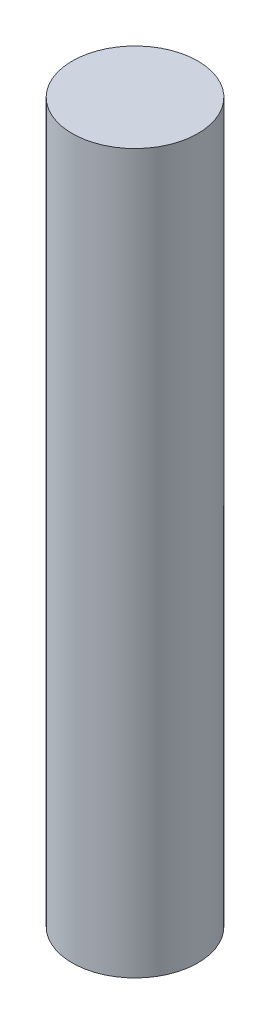
ISO-10303-21;
HEADER;
FILE_DESCRIPTION(('STEP AP214'),'2;1');
FILE_NAME('part.step','',(''),(''),'','','');
FILE_SCHEMA(('AUTOMOTIVE_DESIGN { 1 0 10303 214 1 1 1 1 }'));
ENDSEC;
DATA;
#1=APPLICATION_CONTEXT('core data for automotive mechanical design processes');
#2=APPLICATION_PROTOCOL_DEFINITION('international standard','automotive_design',2000,#1);
#3=PRODUCT_CONTEXT('',#1,'mechanical');
#4=PRODUCT('Part','Part','',(#3));
#5=PRODUCT_RELATED_PRODUCT_CATEGORY('part','',(#4));
#6=PRODUCT_DEFINITION_FORMATION('','',#4);
#7=PRODUCT_DEFINITION_CONTEXT('part definition',#1,'design');
#8=PRODUCT_DEFINITION('design','',#6,#7);
#9=PRODUCT_DEFINITION_SHAPE('','',#8);
#10=(LENGTH_UNIT() NAMED_UNIT(*) SI_UNIT(.MILLI.,.METRE.));
#11=(NAMED_UNIT(*) PLANE_ANGLE_UNIT() SI_UNIT($,.RADIAN.));
#12=(NAMED_UNIT(*) SI_UNIT($,.STERADIAN.) SOLID_ANGLE_UNIT());
#13=UNCERTAINTY_MEASURE_WITH_UNIT(LENGTH_MEASURE(1.E-05),#10,'distance_accuracy_value','');
#14=(GEOMETRIC_REPRESENTATION_CONTEXT(3) GLOBAL_UNCERTAINTY_ASSIGNED_CONTEXT((#13)) GLOBAL_UNIT_ASSIGNED_CONTEXT((#10,
#11,#12)) REPRESENTATION_CONTEXT('',''));
#15=CARTESIAN_POINT('',(0.,0.,0.));
#16=DIRECTION('',(0.,0.,1.));
#17=DIRECTION('',(1.,0.,0.));
#18=AXIS2_PLACEMENT_3D('',#15,#16,#17);
#19=CARTESIAN_POINT('',(2.77555756156289E-13,30.4799999999995,0.));
#20=DIRECTION('',(0.,-0.999999999999995,0.));
#21=DIRECTION('',(0.,0.,-0.999999999999992));
#22=AXIS2_PLACEMENT_3D('',#19,#20,#21);
#23=CYLINDRICAL_SURFACE('',#22,2.667);
#24=CARTESIAN_POINT('',(2.77555756156289E-13,30.4799999999995,0.));
#25=DIRECTION('',(0.,0.999999999999995,0.));
#26=DIRECTION('',(0.,0.,0.999999999999992));
#27=AXIS2_PLACEMENT_3D('',#24,#25,#26);
#28=CIRCLE('',#27,2.667);
#29=CARTESIAN_POINT('',(2.68820909976597E-13,30.4799999999995,-2.66699999999996));
#30=VERTEX_POINT('',#29);
#31=EDGE_CURVE('E12',#30,#30,#28,.T.);
#32=CARTESIAN_POINT('',(0.,0.,0.));
#33=DIRECTION('',(0.,0.999999999999995,0.));
#34=DIRECTION('',(0.,0.,0.999999999999992));
#35=AXIS2_PLACEMENT_3D('',#32,#33,#34);
#36=CIRCLE('',#35,2.667);
#37=CARTESIAN_POINT('',(3.95719401691251E-13,0.,-2.66700000000013));
#38=VERTEX_POINT('',#37);
#39=EDGE_CURVE('E53',#38,#38,#36,.T.);
#40=CARTESIAN_POINT('',(2.68820909976597E-13,30.4799999999995,-2.66699999999996));
#41=CARTESIAN_POINT('',(2.70142769265291E-13,30.1624999999996,-2.66699999999996));
#42=CARTESIAN_POINT('',(2.71464628553986E-13,29.8449999999996,-2.66699999999996));
#43=CARTESIAN_POINT('',(2.74108347131374E-13,29.2099999999996,-2.66699999999997));
#44=CARTESIAN_POINT('',(2.75430206420069E-13,28.8924999999996,-2.66699999999997));
#45=CARTESIAN_POINT('',(2.78073924997457E-13,28.2574999999996,-2.66699999999997));
#46=CARTESIAN_POINT('',(2.79395784286151E-13,27.9399999999996,-2.66699999999997));
#47=CARTESIAN_POINT('',(2.8203950286354E-13,27.3049999999996,-2.66699999999998));
#48=CARTESIAN_POINT('',(2.83361362152234E-13,26.9874999999996,-2.66699999999998));
#49=CARTESIAN_POINT('',(2.86005080729623E-13,26.3524999999996,-2.66699999999998));
#50=CARTESIAN_POINT('',(2.87326940018317E-13,26.0349999999996,-2.66699999999998));
#51=CARTESIAN_POINT('',(2.89970658595706E-13,25.3999999999996,-2.66699999999999));
#52=CARTESIAN_POINT('',(2.912925178844E-13,25.0824999999996,-2.66699999999999));
#53=CARTESIAN_POINT('',(2.93936236461789E-13,24.4474999999996,-2.66699999999999));
#54=CARTESIAN_POINT('',(2.95258095750483E-13,24.1299999999996,-2.66699999999999));
#55=CARTESIAN_POINT('',(2.97901814327872E-13,23.4949999999997,-2.667));
#56=CARTESIAN_POINT('',(2.99223673616566E-13,23.1774999999997,-2.667));
#57=CARTESIAN_POINT('',(3.01867392193955E-13,22.5424999999997,-2.667));
#58=CARTESIAN_POINT('',(3.03189251482649E-13,22.2249999999997,-2.66700000000001));
#59=CARTESIAN_POINT('',(3.05832970060038E-13,21.5899999999997,-2.66700000000001));
#60=CARTESIAN_POINT('',(3.07154829348732E-13,21.2724999999997,-2.66700000000001));
#61=CARTESIAN_POINT('',(3.09798547926121E-13,20.6374999999997,-2.66700000000001));
#62=CARTESIAN_POINT('',(3.11120407214815E-13,20.3199999999997,-2.66700000000002));
#63=CARTESIAN_POINT('',(3.13764125792204E-13,19.6849999999997,-2.66700000000002));
#64=CARTESIAN_POINT('',(3.15085985080898E-13,19.3674999999997,-2.66700000000002));
#65=CARTESIAN_POINT('',(3.17729703658287E-13,18.7324999999997,-2.66700000000003));
#66=CARTESIAN_POINT('',(3.19051562946981E-13,18.4149999999997,-2.66700000000003));
#67=CARTESIAN_POINT('',(3.21695281524369E-13,17.7799999999997,-2.66700000000003));
#68=CARTESIAN_POINT('',(3.23017140813064E-13,17.4624999999997,-2.66700000000003));
#69=CARTESIAN_POINT('',(3.25660859390452E-13,16.8274999999998,-2.66700000000004));
#70=CARTESIAN_POINT('',(3.26982718679147E-13,16.5099999999998,-2.66700000000004));
#71=CARTESIAN_POINT('',(3.29626437256535E-13,15.8749999999998,-2.66700000000004));
#72=CARTESIAN_POINT('',(3.3094829654523E-13,15.5574999999998,-2.66700000000004));
#73=CARTESIAN_POINT('',(3.33592015122618E-13,14.9224999999998,-2.66700000000005));
#74=CARTESIAN_POINT('',(3.34913874411313E-13,14.6049999999998,-2.66700000000005));
#75=CARTESIAN_POINT('',(3.37557592988701E-13,13.9699999999998,-2.66700000000005));
#76=CARTESIAN_POINT('',(3.38879452277396E-13,13.6524999999998,-2.66700000000006));
#77=CARTESIAN_POINT('',(3.41523170854784E-13,13.0174999999998,-2.66700000000006));
#78=CARTESIAN_POINT('',(3.42845030143478E-13,12.6999999999998,-2.66700000000006));
#79=CARTESIAN_POINT('',(3.45488748720867E-13,12.0649999999998,-2.66700000000006));
#80=CARTESIAN_POINT('',(3.46810608009561E-13,11.7474999999998,-2.66700000000007));
#81=CARTESIAN_POINT('',(3.4945432658695E-13,11.1124999999998,-2.66700000000007));
#82=CARTESIAN_POINT('',(3.50776185875644E-13,10.7949999999999,-2.66700000000007));
#83=CARTESIAN_POINT('',(3.53419904453033E-13,10.1599999999999,-2.66700000000008));
#84=CARTESIAN_POINT('',(3.54741763741727E-13,9.84249999999987,-2.66700000000008));
#85=CARTESIAN_POINT('',(3.57385482319116E-13,9.20749999999987,-2.66700000000008));
#86=CARTESIAN_POINT('',(3.5870734160781E-13,8.88999999999988,-2.66700000000008));
#87=CARTESIAN_POINT('',(3.61351060185199E-13,8.25499999999989,-2.66700000000009));
#88=CARTESIAN_POINT('',(3.62672919473893E-13,7.93749999999989,-2.66700000000009));
#89=CARTESIAN_POINT('',(3.65316638051282E-13,7.3024999999999,-2.66700000000009));
#90=CARTESIAN_POINT('',(3.66638497339976E-13,6.98499999999991,-2.66700000000009));
#91=CARTESIAN_POINT('',(3.69282215917365E-13,6.34999999999992,-2.6670000000001));
#92=CARTESIAN_POINT('',(3.70604075206059E-13,6.03249999999992,-2.6670000000001));
#93=CARTESIAN_POINT('',(3.73247793783448E-13,5.39749999999993,-2.6670000000001));
#94=CARTESIAN_POINT('',(3.74569653072142E-13,5.07999999999994,-2.6670000000001));
#95=CARTESIAN_POINT('',(3.77213371649531E-13,4.44499999999995,-2.66700000000011));
#96=CARTESIAN_POINT('',(3.78535230938225E-13,4.12749999999995,-2.66700000000011));
#97=CARTESIAN_POINT('',(3.81178949515614E-13,3.49249999999996,-2.66700000000011));
#98=CARTESIAN_POINT('',(3.82500808804308E-13,3.17499999999997,-2.66700000000012));
#99=CARTESIAN_POINT('',(3.85144527381697E-13,2.53999999999998,-2.66700000000012));
#100=CARTESIAN_POINT('',(3.86466386670391E-13,2.22249999999998,-2.66700000000012));
#101=CARTESIAN_POINT('',(3.89110105247779E-13,1.58749999999999,-2.66700000000012));
#102=CARTESIAN_POINT('',(3.90431964536474E-13,1.26999999999999,-2.66700000000013));
#103=CARTESIAN_POINT('',(3.93075683113862E-13,0.635000000000004,-2.66700000000013));
#104=CARTESIAN_POINT('',(3.94397542402557E-13,0.317500000000008,-2.66700000000013));
#105=CARTESIAN_POINT('',(3.95719401691251E-13,0.,-2.66700000000013));
#106=B_SPLINE_CURVE_WITH_KNOTS('',3,(#40,#41,#42,#43,#44,#45,#46,#47,#48,#49,#50,#51,#52,#53,
#54,#55,#56,#57,#58,#59,#60,#61,#62,#63,#64,#65,#66,#67,#68,#69,#70,#71,#72,#73,#74,#75,#76,#77,
#78,#79,#80,#81,#82,#83,#84,#85,#86,#87,#88,#89,#90,#91,#92,#93,#94,#95,#96,#97,#98,#99,#100,
#101,#102,#103,#104,#105),.UNSPECIFIED.,.F.,.F.,(4,2,2,2,2,2,2,2,2,2,2,2,2,2,2,2,2,2,2,2,2,2,2,
2,2,2,2,2,2,2,2,2,4),(0.,0.952499999999985,1.90499999999997,2.85749999999995,3.80999999999994,
4.76249999999993,5.71499999999991,6.6674999999999,7.61999999999988,8.57249999999986,
9.52499999999985,10.4774999999998,11.4299999999998,12.3824999999998,13.3349999999998,
14.2874999999998,15.2399999999998,16.1924999999998,17.1449999999997,18.0974999999997,
19.0499999999997,20.0024999999997,20.9549999999997,21.9074999999997,22.8599999999997,
23.8124999999996,24.7649999999996,25.7174999999996,26.6699999999996,27.6224999999996,
28.5749999999996,29.5274999999996,30.4799999999995),.UNSPECIFIED.);
#107=EDGE_CURVE('BSEAM50',#30,#38,#106,.T.);
#108=ORIENTED_EDGE('',*,*,#31,.F.);
#109=ORIENTED_EDGE('',*,*,#39,.T.);
#110=ORIENTED_EDGE('',*,*,#107,.T.);
#111=ORIENTED_EDGE('',*,*,#107,.F.);
#112=EDGE_LOOP('',(#108,#110,#109,#111));
#113=FACE_BOUND('',#112,.T.);
#114=ADVANCED_FACE('F50',(#113),#23,.T.);
#115=CARTESIAN_POINT('',(2.77555756156289E-13,30.4799999999995,0.));
#116=DIRECTION('',(0.,0.999999999999995,0.));
#117=DIRECTION('',(0.,0.,0.999999999999992));
#118=AXIS2_PLACEMENT_3D('',#115,#116,#117);
#119=PLANE('',#118);
#120=ORIENTED_EDGE('',*,*,#31,.T.);
#121=EDGE_LOOP('',(#120));
#122=FACE_BOUND('',#121,.T.);
#123=ADVANCED_FACE('F69',(#122),#119,.T.);
#124=CARTESIAN_POINT('',(0.,0.,0.));
#125=DIRECTION('',(0.,0.999999999999995,0.));
#126=DIRECTION('',(0.,0.,0.999999999999992));
#127=AXIS2_PLACEMENT_3D('',#124,#125,#126);
#128=PLANE('',#127);
#129=ORIENTED_EDGE('',*,*,#39,.F.);
#130=EDGE_LOOP('',(#129));
#131=FACE_BOUND('',#130,.T.);
#132=ADVANCED_FACE('F67',(#131),#128,.F.);
#133=CLOSED_SHELL('',(#114,#123,#132));
#134=MANIFOLD_SOLID_BREP('B2',#133);
#135=ADVANCED_BREP_SHAPE_REPRESENTATION('',(#18,#134),#14);
#136=SHAPE_DEFINITION_REPRESENTATION(#9,#135);
ENDSEC;
END-ISO-10303-21;
